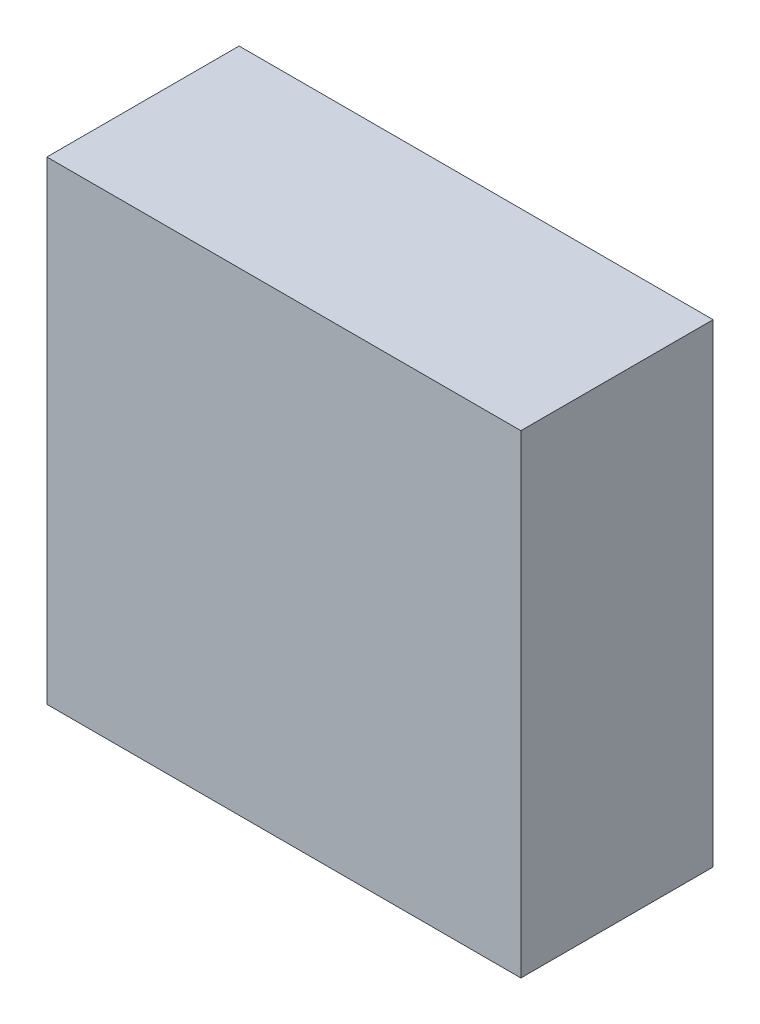
ISO-10303-21;
HEADER;
FILE_DESCRIPTION(('STEP AP214'),'2;1');
FILE_NAME('part.step','',(''),(''),'','','');
FILE_SCHEMA(('AUTOMOTIVE_DESIGN { 1 0 10303 214 1 1 1 1 }'));
ENDSEC;
DATA;
#1=APPLICATION_CONTEXT('core data for automotive mechanical design processes');
#2=APPLICATION_PROTOCOL_DEFINITION('international standard','automotive_design',2000,#1);
#3=PRODUCT_CONTEXT('',#1,'mechanical');
#4=PRODUCT('Part','Part','',(#3));
#5=PRODUCT_RELATED_PRODUCT_CATEGORY('part','',(#4));
#6=PRODUCT_DEFINITION_FORMATION('','',#4);
#7=PRODUCT_DEFINITION_CONTEXT('part definition',#1,'design');
#8=PRODUCT_DEFINITION('design','',#6,#7);
#9=PRODUCT_DEFINITION_SHAPE('','',#8);
#10=(LENGTH_UNIT() NAMED_UNIT(*) SI_UNIT(.MILLI.,.METRE.));
#11=(NAMED_UNIT(*) PLANE_ANGLE_UNIT() SI_UNIT($,.RADIAN.));
#12=(NAMED_UNIT(*) SI_UNIT($,.STERADIAN.) SOLID_ANGLE_UNIT());
#13=UNCERTAINTY_MEASURE_WITH_UNIT(LENGTH_MEASURE(1.E-05),#10,'distance_accuracy_value','');
#14=(GEOMETRIC_REPRESENTATION_CONTEXT(3) GLOBAL_UNCERTAINTY_ASSIGNED_CONTEXT((#13)) GLOBAL_UNIT_ASSIGNED_CONTEXT((#10,
#11,#12)) REPRESENTATION_CONTEXT('',''));
#15=CARTESIAN_POINT('',(0.,0.,0.));
#16=DIRECTION('',(0.,0.,1.));
#17=DIRECTION('',(1.,0.,0.));
#18=AXIS2_PLACEMENT_3D('',#15,#16,#17);
#19=CARTESIAN_POINT('',(0.,0.,18.25));
#20=DIRECTION('',(1.,0.,0.));
#21=DIRECTION('',(0.,0.,-1.));
#22=AXIS2_PLACEMENT_3D('',#19,#20,#21);
#23=PLANE('',#22);
#24=DIRECTION('',(0.,-1.,0.));
#25=VECTOR('',#24,1.);
#26=CARTESIAN_POINT('',(0.,0.,0.));
#27=LINE('',#26,#25);
#28=CARTESIAN_POINT('',(0.,0.,0.));
#29=VERTEX_POINT('',#28);
#30=CARTESIAN_POINT('',(0.,-45.,0.));
#31=VERTEX_POINT('',#30);
#32=EDGE_CURVE('E95',#29,#31,#27,.T.);
#33=ORIENTED_EDGE('',*,*,#32,.T.);
#34=DIRECTION('',(0.,0.,-1.));
#35=VECTOR('',#34,1.);
#36=CARTESIAN_POINT('',(0.,-45.,18.25));
#37=LINE('',#36,#35);
#38=CARTESIAN_POINT('',(0.,-45.,18.25));
#39=VERTEX_POINT('',#38);
#40=EDGE_CURVE('E11',#39,#31,#37,.T.);
#41=ORIENTED_EDGE('',*,*,#40,.F.);
#42=DIRECTION('',(0.,-1.,0.));
#43=VECTOR('',#42,1.);
#44=CARTESIAN_POINT('',(0.,0.,18.25));
#45=LINE('',#44,#43);
#46=CARTESIAN_POINT('',(0.,0.,18.25));
#47=VERTEX_POINT('',#46);
#48=EDGE_CURVE('E83',#47,#39,#45,.T.);
#49=ORIENTED_EDGE('',*,*,#48,.F.);
#50=DIRECTION('',(0.,0.,-1.));
#51=VECTOR('',#50,1.);
#52=CARTESIAN_POINT('',(0.,0.,18.25));
#53=LINE('',#52,#51);
#54=EDGE_CURVE('E91',#47,#29,#53,.T.);
#55=ORIENTED_EDGE('',*,*,#54,.T.);
#56=EDGE_LOOP('',(#33,#41,#49,#55));
#57=FACE_BOUND('',#56,.T.);
#58=ADVANCED_FACE('F32',(#57),#23,.F.);
#59=CARTESIAN_POINT('',(0.,-45.,18.25));
#60=DIRECTION('',(0.,1.,0.));
#61=DIRECTION('',(0.,0.,1.));
#62=AXIS2_PLACEMENT_3D('',#59,#60,#61);
#63=PLANE('',#62);
#64=DIRECTION('',(1.,0.,0.));
#65=VECTOR('',#64,1.);
#66=CARTESIAN_POINT('',(0.,-45.,0.));
#67=LINE('',#66,#65);
#68=CARTESIAN_POINT('',(45.,-45.,0.));
#69=VERTEX_POINT('',#68);
#70=EDGE_CURVE('E87',#31,#69,#67,.T.);
#71=ORIENTED_EDGE('',*,*,#70,.T.);
#72=DIRECTION('',(0.,0.,-1.));
#73=VECTOR('',#72,1.);
#74=CARTESIAN_POINT('',(45.,-45.,18.25));
#75=LINE('',#74,#73);
#76=CARTESIAN_POINT('',(45.,-45.,18.25));
#77=VERTEX_POINT('',#76);
#78=EDGE_CURVE('E40',#77,#69,#75,.T.);
#79=ORIENTED_EDGE('',*,*,#78,.F.);
#80=DIRECTION('',(1.,0.,0.));
#81=VECTOR('',#80,1.);
#82=CARTESIAN_POINT('',(0.,-45.,18.25));
#83=LINE('',#82,#81);
#84=EDGE_CURVE('E78',#39,#77,#83,.T.);
#85=ORIENTED_EDGE('',*,*,#84,.F.);
#86=ORIENTED_EDGE('',*,*,#40,.T.);
#87=EDGE_LOOP('',(#71,#79,#85,#86));
#88=FACE_BOUND('',#87,.T.);
#89=ADVANCED_FACE('F86',(#88),#63,.F.);
#90=CARTESIAN_POINT('',(45.,0.,18.25));
#91=DIRECTION('',(-1.,0.,0.));
#92=DIRECTION('',(0.,-1.,0.));
#93=AXIS2_PLACEMENT_3D('',#90,#91,#92);
#94=PLANE('',#93);
#95=DIRECTION('',(0.,1.,0.));
#96=VECTOR('',#95,1.);
#97=CARTESIAN_POINT('',(45.,0.,0.));
#98=LINE('',#97,#96);
#99=CARTESIAN_POINT('',(45.,0.,0.));
#100=VERTEX_POINT('',#99);
#101=EDGE_CURVE('E65',#69,#100,#98,.T.);
#102=ORIENTED_EDGE('',*,*,#101,.T.);
#103=DIRECTION('',(0.,0.,-1.));
#104=VECTOR('',#103,1.);
#105=CARTESIAN_POINT('',(45.,0.,18.25));
#106=LINE('',#105,#104);
#107=CARTESIAN_POINT('',(45.,0.,18.25));
#108=VERTEX_POINT('',#107);
#109=EDGE_CURVE('E88',#108,#100,#106,.T.);
#110=ORIENTED_EDGE('',*,*,#109,.F.);
#111=DIRECTION('',(0.,1.,0.));
#112=VECTOR('',#111,1.);
#113=CARTESIAN_POINT('',(45.,0.,18.25));
#114=LINE('',#113,#112);
#115=EDGE_CURVE('E81',#77,#108,#114,.T.);
#116=ORIENTED_EDGE('',*,*,#115,.F.);
#117=ORIENTED_EDGE('',*,*,#78,.T.);
#118=EDGE_LOOP('',(#102,#110,#116,#117));
#119=FACE_BOUND('',#118,.T.);
#120=ADVANCED_FACE('F89',(#119),#94,.F.);
#121=CARTESIAN_POINT('',(0.,0.,18.25));
#122=DIRECTION('',(0.,-1.,0.));
#123=DIRECTION('',(0.,0.,-1.));
#124=AXIS2_PLACEMENT_3D('',#121,#122,#123);
#125=PLANE('',#124);
#126=DIRECTION('',(-1.,0.,0.));
#127=VECTOR('',#126,1.);
#128=CARTESIAN_POINT('',(0.,0.,0.));
#129=LINE('',#128,#127);
#130=EDGE_CURVE('E71',#100,#29,#129,.T.);
#131=ORIENTED_EDGE('',*,*,#130,.T.);
#132=ORIENTED_EDGE('',*,*,#54,.F.);
#133=DIRECTION('',(-1.,0.,0.));
#134=VECTOR('',#133,1.);
#135=CARTESIAN_POINT('',(0.,0.,18.25));
#136=LINE('',#135,#134);
#137=EDGE_CURVE('E48',#108,#47,#136,.T.);
#138=ORIENTED_EDGE('',*,*,#137,.F.);
#139=ORIENTED_EDGE('',*,*,#109,.T.);
#140=EDGE_LOOP('',(#131,#132,#138,#139));
#141=FACE_BOUND('',#140,.T.);
#142=ADVANCED_FACE('F102',(#141),#125,.F.);
#143=CARTESIAN_POINT('',(0.,0.,18.25));
#144=DIRECTION('',(0.,0.,1.));
#145=DIRECTION('',(1.,0.,0.));
#146=AXIS2_PLACEMENT_3D('',#143,#144,#145);
#147=PLANE('',#146);
#148=ORIENTED_EDGE('',*,*,#48,.T.);
#149=ORIENTED_EDGE('',*,*,#84,.T.);
#150=ORIENTED_EDGE('',*,*,#115,.T.);
#151=ORIENTED_EDGE('',*,*,#137,.T.);
#152=EDGE_LOOP('',(#148,#149,#150,#151));
#153=FACE_BOUND('',#152,.T.);
#154=ADVANCED_FACE('F79',(#153),#147,.T.);
#155=CARTESIAN_POINT('',(0.,0.,0.));
#156=DIRECTION('',(0.,0.,1.));
#157=DIRECTION('',(1.,0.,0.));
#158=AXIS2_PLACEMENT_3D('',#155,#156,#157);
#159=PLANE('',#158);
#160=ORIENTED_EDGE('',*,*,#32,.F.);
#161=ORIENTED_EDGE('',*,*,#130,.F.);
#162=ORIENTED_EDGE('',*,*,#101,.F.);
#163=ORIENTED_EDGE('',*,*,#70,.F.);
#164=EDGE_LOOP('',(#160,#161,#162,#163));
#165=FACE_BOUND('',#164,.T.);
#166=ADVANCED_FACE('F105',(#165),#159,.F.);
#167=CLOSED_SHELL('',(#58,#89,#120,#142,#154,#166));
#168=MANIFOLD_SOLID_BREP('B2',#167);
#169=ADVANCED_BREP_SHAPE_REPRESENTATION('',(#18,#168),#14);
#170=SHAPE_DEFINITION_REPRESENTATION(#9,#169);
ENDSEC;
END-ISO-10303-21;
